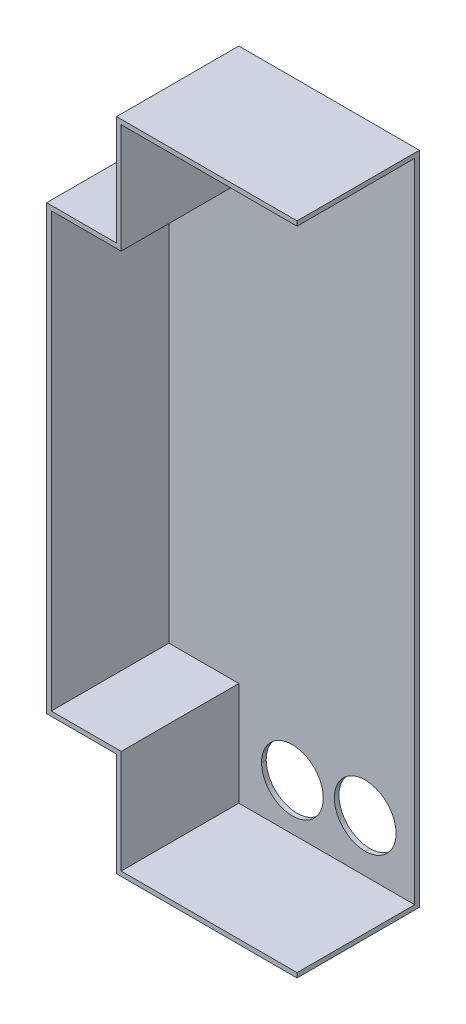
ISO-10303-21;
HEADER;
FILE_DESCRIPTION(('STEP AP214'),'2;1');
FILE_NAME('part.step','',(''),(''),'','','');
FILE_SCHEMA(('AUTOMOTIVE_DESIGN { 1 0 10303 214 1 1 1 1 }'));
ENDSEC;
DATA;
#1=APPLICATION_CONTEXT('core data for automotive mechanical design processes');
#2=APPLICATION_PROTOCOL_DEFINITION('international standard','automotive_design',2000,#1);
#3=PRODUCT_CONTEXT('',#1,'mechanical');
#4=PRODUCT('Part','Part','',(#3));
#5=PRODUCT_RELATED_PRODUCT_CATEGORY('part','',(#4));
#6=PRODUCT_DEFINITION_FORMATION('','',#4);
#7=PRODUCT_DEFINITION_CONTEXT('part definition',#1,'design');
#8=PRODUCT_DEFINITION('design','',#6,#7);
#9=PRODUCT_DEFINITION_SHAPE('','',#8);
#10=(LENGTH_UNIT() NAMED_UNIT(*) SI_UNIT(.MILLI.,.METRE.));
#11=(NAMED_UNIT(*) PLANE_ANGLE_UNIT() SI_UNIT($,.RADIAN.));
#12=(NAMED_UNIT(*) SI_UNIT($,.STERADIAN.) SOLID_ANGLE_UNIT());
#13=UNCERTAINTY_MEASURE_WITH_UNIT(LENGTH_MEASURE(1.E-05),#10,'distance_accuracy_value','');
#14=(GEOMETRIC_REPRESENTATION_CONTEXT(3) GLOBAL_UNCERTAINTY_ASSIGNED_CONTEXT((#13)) GLOBAL_UNIT_ASSIGNED_CONTEXT((#10,
#11,#12)) REPRESENTATION_CONTEXT('',''));
#15=CARTESIAN_POINT('',(0.,0.,0.));
#16=DIRECTION('',(0.,0.,1.));
#17=DIRECTION('',(1.,0.,0.));
#18=AXIS2_PLACEMENT_3D('',#15,#16,#17);
#19=CARTESIAN_POINT('',(-173.189136,68.461618,0.));
#20=DIRECTION('',(0.,0.,1.));
#21=DIRECTION('',(-1.,0.,0.));
#22=AXIS2_PLACEMENT_3D('',#19,#20,#21);
#23=CYLINDRICAL_SURFACE('',#22,2.65);
#24=CARTESIAN_POINT('',(-173.189136,68.461618,0.4));
#25=DIRECTION('',(0.,0.,1.));
#26=DIRECTION('',(1.,0.,0.));
#27=AXIS2_PLACEMENT_3D('',#24,#25,#26);
#28=CIRCLE('',#27,2.65);
#29=CARTESIAN_POINT('',(-175.839136,68.461618,0.4));
#30=VERTEX_POINT('',#29);
#31=CARTESIAN_POINT('',(-170.539136,68.461618,0.4));
#32=VERTEX_POINT('',#31);
#33=EDGE_CURVE('E311',#30,#32,#28,.T.);
#34=ORIENTED_EDGE('',*,*,#33,.T.);
#35=DIRECTION('',(0.,0.,1.));
#36=VECTOR('',#35,1.);
#37=CARTESIAN_POINT('',(-170.539136,68.461618,0.));
#38=LINE('',#37,#36);
#39=CARTESIAN_POINT('',(-170.539136,68.461618,0.));
#40=VERTEX_POINT('',#39);
#41=EDGE_CURVE('E39',#40,#32,#38,.T.);
#42=ORIENTED_EDGE('',*,*,#41,.F.);
#43=CARTESIAN_POINT('',(-173.189136,68.461618,0.));
#44=DIRECTION('',(0.,0.,-1.));
#45=DIRECTION('',(-1.,0.,0.));
#46=AXIS2_PLACEMENT_3D('',#43,#44,#45);
#47=CIRCLE('',#46,2.65);
#48=CARTESIAN_POINT('',(-175.839136,68.461618,0.));
#49=VERTEX_POINT('',#48);
#50=EDGE_CURVE('E331',#40,#49,#47,.T.);
#51=ORIENTED_EDGE('',*,*,#50,.T.);
#52=DIRECTION('',(0.,0.,1.));
#53=VECTOR('',#52,1.);
#54=CARTESIAN_POINT('',(-175.839136,68.461618,0.));
#55=LINE('',#54,#53);
#56=EDGE_CURVE('E26',#49,#30,#55,.T.);
#57=ORIENTED_EDGE('',*,*,#56,.T.);
#58=EDGE_LOOP('',(#34,#42,#51,#57));
#59=FACE_BOUND('',#58,.T.);
#60=ADVANCED_FACE('F17',(#59),#23,.F.);
#61=CARTESIAN_POINT('',(-166.9391344268,21.46163400861,-1.0836));
#62=DIRECTION('',(0.,0.,1.));
#63=DIRECTION('',(0.,1.,0.));
#64=AXIS2_PLACEMENT_3D('',#61,#62,#63);
#65=CYLINDRICAL_SURFACE('',#64,2.65);
#66=DIRECTION('',(0.,0.,1.));
#67=VECTOR('',#66,1.);
#68=CARTESIAN_POINT('',(-166.9391344268,24.11163400861,-1.0836));
#69=LINE('',#68,#67);
#70=CARTESIAN_POINT('',(-166.9391344268,24.11163400861,0.));
#71=VERTEX_POINT('',#70);
#72=CARTESIAN_POINT('',(-166.9391344268,24.11163400861,0.4));
#73=VERTEX_POINT('',#72);
#74=EDGE_CURVE('E456',#71,#73,#69,.T.);
#75=ORIENTED_EDGE('',*,*,#74,.T.);
#76=CARTESIAN_POINT('',(-166.9391344268,21.46163400861,0.4));
#77=DIRECTION('',(0.,0.,1.));
#78=DIRECTION('',(0.,-1.,0.));
#79=AXIS2_PLACEMENT_3D('',#76,#77,#78);
#80=CIRCLE('',#79,2.65);
#81=CARTESIAN_POINT('',(-166.9391344268,18.81163400861,0.4));
#82=VERTEX_POINT('',#81);
#83=EDGE_CURVE('E431',#73,#82,#80,.T.);
#84=ORIENTED_EDGE('',*,*,#83,.T.);
#85=DIRECTION('',(0.,0.,1.));
#86=VECTOR('',#85,1.);
#87=CARTESIAN_POINT('',(-166.9391344268,18.81163400861,-1.0836));
#88=LINE('',#87,#86);
#89=CARTESIAN_POINT('',(-166.9391344268,18.81163400861,0.));
#90=VERTEX_POINT('',#89);
#91=EDGE_CURVE('E453',#90,#82,#88,.T.);
#92=ORIENTED_EDGE('',*,*,#91,.F.);
#93=CARTESIAN_POINT('',(-166.9391344268,21.46163400861,0.));
#94=DIRECTION('',(0.,0.,-1.));
#95=DIRECTION('',(0.,1.,0.));
#96=AXIS2_PLACEMENT_3D('',#93,#94,#95);
#97=CIRCLE('',#96,2.65);
#98=EDGE_CURVE('E272',#90,#71,#97,.T.);
#99=ORIENTED_EDGE('',*,*,#98,.T.);
#100=EDGE_LOOP('',(#75,#84,#92,#99));
#101=FACE_BOUND('',#100,.T.);
#102=ADVANCED_FACE('F494',(#101),#65,.F.);
#103=CARTESIAN_POINT('',(-173.189136,20.961634,0.));
#104=DIRECTION('',(0.,0.,1.));
#105=DIRECTION('',(-1.,0.,0.));
#106=AXIS2_PLACEMENT_3D('',#103,#104,#105);
#107=CYLINDRICAL_SURFACE('',#106,2.65);
#108=DIRECTION('',(0.,0.,1.));
#109=VECTOR('',#108,1.);
#110=CARTESIAN_POINT('',(-175.839136,20.961634,0.));
#111=LINE('',#110,#109);
#112=CARTESIAN_POINT('',(-175.839136,20.961634,0.));
#113=VERTEX_POINT('',#112);
#114=CARTESIAN_POINT('',(-175.839136,20.961634,0.4));
#115=VERTEX_POINT('',#114);
#116=EDGE_CURVE('E20',#113,#115,#111,.T.);
#117=ORIENTED_EDGE('',*,*,#116,.T.);
#118=CARTESIAN_POINT('',(-173.189136,20.961634,0.4));
#119=DIRECTION('',(0.,0.,1.));
#120=DIRECTION('',(1.,0.,0.));
#121=AXIS2_PLACEMENT_3D('',#118,#119,#120);
#122=CIRCLE('',#121,2.65);
#123=CARTESIAN_POINT('',(-170.539136,20.961634,0.4));
#124=VERTEX_POINT('',#123);
#125=EDGE_CURVE('E345',#115,#124,#122,.T.);
#126=ORIENTED_EDGE('',*,*,#125,.T.);
#127=DIRECTION('',(0.,0.,1.));
#128=VECTOR('',#127,1.);
#129=CARTESIAN_POINT('',(-170.539136,20.961634,0.));
#130=LINE('',#129,#128);
#131=CARTESIAN_POINT('',(-170.539136,20.961634,0.));
#132=VERTEX_POINT('',#131);
#133=EDGE_CURVE('E423',#132,#124,#130,.T.);
#134=ORIENTED_EDGE('',*,*,#133,.F.);
#135=CARTESIAN_POINT('',(-173.189136,20.961634,0.));
#136=DIRECTION('',(0.,0.,-1.));
#137=DIRECTION('',(-1.,0.,0.));
#138=AXIS2_PLACEMENT_3D('',#135,#136,#137);
#139=CIRCLE('',#138,2.65);
#140=EDGE_CURVE('E324',#132,#113,#139,.T.);
#141=ORIENTED_EDGE('',*,*,#140,.T.);
#142=EDGE_LOOP('',(#117,#126,#134,#141));
#143=FACE_BOUND('',#142,.T.);
#144=ADVANCED_FACE('F469',(#143),#107,.F.);
#145=CARTESIAN_POINT('',(-184.189136,22.411626,0.));
#146=DIRECTION('',(-1.,0.,0.));
#147=DIRECTION('',(0.,0.,1.));
#148=AXIS2_PLACEMENT_3D('',#145,#146,#147);
#149=PLANE('',#148);
#150=DIRECTION('',(0.,1.,0.));
#151=VECTOR('',#150,1.);
#152=CARTESIAN_POINT('',(-184.189136,25.461626,0.));
#153=LINE('',#152,#151);
#154=CARTESIAN_POINT('',(-184.189136,25.461626,0.));
#155=VERTEX_POINT('',#154);
#156=CARTESIAN_POINT('',(-184.189136,63.461626,0.));
#157=VERTEX_POINT('',#156);
#158=EDGE_CURVE('E256',#155,#157,#153,.T.);
#159=ORIENTED_EDGE('',*,*,#158,.F.);
#160=DIRECTION('',(0.,0.,1.));
#161=VECTOR('',#160,1.);
#162=CARTESIAN_POINT('',(-184.189136,25.461626,0.));
#163=LINE('',#162,#161);
#164=CARTESIAN_POINT('',(-184.189136,25.461626,10.5));
#165=VERTEX_POINT('',#164);
#166=EDGE_CURVE('E11',#155,#165,#163,.T.);
#167=ORIENTED_EDGE('',*,*,#166,.T.);
#168=DIRECTION('',(0.,1.,0.));
#169=VECTOR('',#168,1.);
#170=CARTESIAN_POINT('',(-184.189136,25.461626,10.5));
#171=LINE('',#170,#169);
#172=CARTESIAN_POINT('',(-184.189136,63.461626,10.5));
#173=VERTEX_POINT('',#172);
#174=EDGE_CURVE('E359',#165,#173,#171,.T.);
#175=ORIENTED_EDGE('',*,*,#174,.T.);
#176=DIRECTION('',(0.,0.,1.));
#177=VECTOR('',#176,1.);
#178=CARTESIAN_POINT('',(-184.189136,63.461626,0.));
#179=LINE('',#178,#177);
#180=EDGE_CURVE('E424',#157,#173,#179,.T.);
#181=ORIENTED_EDGE('',*,*,#180,.F.);
#182=EDGE_LOOP('',(#159,#167,#175,#181));
#183=FACE_BOUND('',#182,.T.);
#184=ADVANCED_FACE('F558',(#183),#149,.T.);
#185=CARTESIAN_POINT('',(-172.989136,25.461626,0.));
#186=DIRECTION('',(0.,-1.,0.));
#187=DIRECTION('',(0.,0.,-1.));
#188=AXIS2_PLACEMENT_3D('',#185,#186,#187);
#189=PLANE('',#188);
#190=DIRECTION('',(-1.,0.,0.));
#191=VECTOR('',#190,1.);
#192=CARTESIAN_POINT('',(-178.189136,25.461626,0.));
#193=LINE('',#192,#191);
#194=CARTESIAN_POINT('',(-178.189136,25.461626,0.));
#195=VERTEX_POINT('',#194);
#196=EDGE_CURVE('E253',#195,#155,#193,.T.);
#197=ORIENTED_EDGE('',*,*,#196,.F.);
#198=DIRECTION('',(0.,0.,1.));
#199=VECTOR('',#198,1.);
#200=CARTESIAN_POINT('',(-178.189136,25.461626,0.));
#201=LINE('',#200,#199);
#202=CARTESIAN_POINT('',(-178.189136,25.461626,10.5));
#203=VERTEX_POINT('',#202);
#204=EDGE_CURVE('E225',#195,#203,#201,.T.);
#205=ORIENTED_EDGE('',*,*,#204,.T.);
#206=DIRECTION('',(-1.,0.,0.));
#207=VECTOR('',#206,1.);
#208=CARTESIAN_POINT('',(-178.189136,25.461626,10.5));
#209=LINE('',#208,#207);
#210=EDGE_CURVE('E284',#203,#165,#209,.T.);
#211=ORIENTED_EDGE('',*,*,#210,.T.);
#212=ORIENTED_EDGE('',*,*,#166,.F.);
#213=EDGE_LOOP('',(#197,#205,#211,#212));
#214=FACE_BOUND('',#213,.T.);
#215=ADVANCED_FACE('F554',(#214),#189,.T.);
#216=CARTESIAN_POINT('',(-178.189136,61.511626,0.));
#217=DIRECTION('',(-1.,0.,0.));
#218=DIRECTION('',(0.,0.,1.));
#219=AXIS2_PLACEMENT_3D('',#216,#217,#218);
#220=PLANE('',#219);
#221=DIRECTION('',(0.,1.,0.));
#222=VECTOR('',#221,1.);
#223=CARTESIAN_POINT('',(-178.189136,63.461626,0.));
#224=LINE('',#223,#222);
#225=CARTESIAN_POINT('',(-178.189136,63.461626,0.));
#226=VERTEX_POINT('',#225);
#227=CARTESIAN_POINT('',(-178.189136,72.861621,0.));
#228=VERTEX_POINT('',#227);
#229=EDGE_CURVE('E294',#226,#228,#224,.T.);
#230=ORIENTED_EDGE('',*,*,#229,.F.);
#231=DIRECTION('',(0.,0.,1.));
#232=VECTOR('',#231,1.);
#233=CARTESIAN_POINT('',(-178.189136,63.461626,0.));
#234=LINE('',#233,#232);
#235=CARTESIAN_POINT('',(-178.189136,63.461626,10.5));
#236=VERTEX_POINT('',#235);
#237=EDGE_CURVE('E420',#226,#236,#234,.T.);
#238=ORIENTED_EDGE('',*,*,#237,.T.);
#239=DIRECTION('',(0.,1.,0.));
#240=VECTOR('',#239,1.);
#241=CARTESIAN_POINT('',(-178.189136,63.461626,10.5));
#242=LINE('',#241,#240);
#243=CARTESIAN_POINT('',(-178.189136,72.861621,10.5));
#244=VERTEX_POINT('',#243);
#245=EDGE_CURVE('E299',#236,#244,#242,.T.);
#246=ORIENTED_EDGE('',*,*,#245,.T.);
#247=DIRECTION('',(0.,0.,1.));
#248=VECTOR('',#247,1.);
#249=CARTESIAN_POINT('',(-178.189136,72.861621,0.));
#250=LINE('',#249,#248);
#251=EDGE_CURVE('E259',#228,#244,#250,.T.);
#252=ORIENTED_EDGE('',*,*,#251,.F.);
#253=EDGE_LOOP('',(#230,#238,#246,#252));
#254=FACE_BOUND('',#253,.T.);
#255=ADVANCED_FACE('F562',(#254),#220,.T.);
#256=CARTESIAN_POINT('',(-173.189136,68.461618,0.));
#257=DIRECTION('',(0.,0.,1.));
#258=DIRECTION('',(-1.,0.,0.));
#259=AXIS2_PLACEMENT_3D('',#256,#257,#258);
#260=CYLINDRICAL_SURFACE('',#259,2.65);
#261=CARTESIAN_POINT('',(-173.189136,68.461618,0.));
#262=DIRECTION('',(0.,0.,-1.));
#263=DIRECTION('',(-1.,0.,0.));
#264=AXIS2_PLACEMENT_3D('',#261,#262,#263);
#265=CIRCLE('',#264,2.65);
#266=EDGE_CURVE('E328',#49,#40,#265,.T.);
#267=ORIENTED_EDGE('',*,*,#266,.T.);
#268=ORIENTED_EDGE('',*,*,#41,.T.);
#269=CARTESIAN_POINT('',(-173.189136,68.461618,0.4));
#270=DIRECTION('',(0.,0.,1.));
#271=DIRECTION('',(1.,0.,0.));
#272=AXIS2_PLACEMENT_3D('',#269,#270,#271);
#273=CIRCLE('',#272,2.65);
#274=EDGE_CURVE('E307',#32,#30,#273,.T.);
#275=ORIENTED_EDGE('',*,*,#274,.T.);
#276=ORIENTED_EDGE('',*,*,#56,.F.);
#277=EDGE_LOOP('',(#267,#268,#275,#276));
#278=FACE_BOUND('',#277,.T.);
#279=ADVANCED_FACE('F490',(#278),#260,.F.);
#280=CARTESIAN_POINT('',(-83.489134,72.861621,0.));
#281=DIRECTION('',(0.,1.,0.));
#282=DIRECTION('',(1.,0.,0.));
#283=AXIS2_PLACEMENT_3D('',#280,#281,#282);
#284=PLANE('',#283);
#285=DIRECTION('',(1.,0.,0.));
#286=VECTOR('',#285,1.);
#287=CARTESIAN_POINT('',(-178.189136,72.861621,0.));
#288=LINE('',#287,#286);
#289=CARTESIAN_POINT('',(-162.689136,72.861621,0.));
#290=VERTEX_POINT('',#289);
#291=EDGE_CURVE('E298',#228,#290,#288,.T.);
#292=ORIENTED_EDGE('',*,*,#291,.F.);
#293=ORIENTED_EDGE('',*,*,#251,.T.);
#294=DIRECTION('',(-1.,0.,0.));
#295=VECTOR('',#294,1.);
#296=CARTESIAN_POINT('',(-162.689136,72.861621,10.5));
#297=LINE('',#296,#295);
#298=CARTESIAN_POINT('',(-162.689136,72.861621,10.5));
#299=VERTEX_POINT('',#298);
#300=EDGE_CURVE('E304',#299,#244,#297,.T.);
#301=ORIENTED_EDGE('',*,*,#300,.F.);
#302=DIRECTION('',(0.,0.,-1.));
#303=VECTOR('',#302,1.);
#304=CARTESIAN_POINT('',(-162.689136,72.861621,10.5));
#305=LINE('',#304,#303);
#306=EDGE_CURVE('E289',#299,#290,#305,.T.);
#307=ORIENTED_EDGE('',*,*,#306,.T.);
#308=EDGE_LOOP('',(#292,#293,#301,#307));
#309=FACE_BOUND('',#308,.T.);
#310=ADVANCED_FACE('F479',(#309),#284,.T.);
#311=CARTESIAN_POINT('',(-173.189136,20.961634,0.));
#312=DIRECTION('',(0.,0.,1.));
#313=DIRECTION('',(-1.,0.,0.));
#314=AXIS2_PLACEMENT_3D('',#311,#312,#313);
#315=CYLINDRICAL_SURFACE('',#314,2.65);
#316=CARTESIAN_POINT('',(-173.189136,20.961634,0.));
#317=DIRECTION('',(0.,0.,-1.));
#318=DIRECTION('',(-1.,0.,0.));
#319=AXIS2_PLACEMENT_3D('',#316,#317,#318);
#320=CIRCLE('',#319,2.65);
#321=EDGE_CURVE('E276',#113,#132,#320,.T.);
#322=ORIENTED_EDGE('',*,*,#321,.T.);
#323=ORIENTED_EDGE('',*,*,#133,.T.);
#324=CARTESIAN_POINT('',(-173.189136,20.961634,0.4));
#325=DIRECTION('',(0.,0.,1.));
#326=DIRECTION('',(1.,0.,0.));
#327=AXIS2_PLACEMENT_3D('',#324,#325,#326);
#328=CIRCLE('',#327,2.65);
#329=EDGE_CURVE('E435',#124,#115,#328,.T.);
#330=ORIENTED_EDGE('',*,*,#329,.T.);
#331=ORIENTED_EDGE('',*,*,#116,.F.);
#332=EDGE_LOOP('',(#322,#323,#330,#331));
#333=FACE_BOUND('',#332,.T.);
#334=ADVANCED_FACE('F476',(#333),#315,.F.);
#335=CARTESIAN_POINT('',(-180.989136,63.461626,0.));
#336=DIRECTION('',(0.,1.,0.));
#337=DIRECTION('',(1.,0.,0.));
#338=AXIS2_PLACEMENT_3D('',#335,#336,#337);
#339=PLANE('',#338);
#340=DIRECTION('',(1.,0.,0.));
#341=VECTOR('',#340,1.);
#342=CARTESIAN_POINT('',(-184.189136,63.461626,0.));
#343=LINE('',#342,#341);
#344=EDGE_CURVE('E269',#157,#226,#343,.T.);
#345=ORIENTED_EDGE('',*,*,#344,.F.);
#346=ORIENTED_EDGE('',*,*,#180,.T.);
#347=DIRECTION('',(1.,0.,0.));
#348=VECTOR('',#347,1.);
#349=CARTESIAN_POINT('',(-184.189136,63.461626,10.5));
#350=LINE('',#349,#348);
#351=EDGE_CURVE('E303',#173,#236,#350,.T.);
#352=ORIENTED_EDGE('',*,*,#351,.T.);
#353=ORIENTED_EDGE('',*,*,#237,.F.);
#354=EDGE_LOOP('',(#345,#346,#352,#353));
#355=FACE_BOUND('',#354,.T.);
#356=ADVANCED_FACE('F478',(#355),#339,.T.);
#357=CARTESIAN_POINT('',(-166.9391344268,21.46163400861,-1.0836));
#358=DIRECTION('',(0.,0.,1.));
#359=DIRECTION('',(0.,1.,0.));
#360=AXIS2_PLACEMENT_3D('',#357,#358,#359);
#361=CYLINDRICAL_SURFACE('',#360,2.65);
#362=CARTESIAN_POINT('',(-166.9391344268,21.46163400861,0.));
#363=DIRECTION('',(0.,0.,-1.));
#364=DIRECTION('',(0.,1.,0.));
#365=AXIS2_PLACEMENT_3D('',#362,#363,#364);
#366=CIRCLE('',#365,2.65);
#367=EDGE_CURVE('E277',#71,#90,#366,.T.);
#368=ORIENTED_EDGE('',*,*,#367,.T.);
#369=ORIENTED_EDGE('',*,*,#91,.T.);
#370=CARTESIAN_POINT('',(-166.9391344268,21.46163400861,0.4));
#371=DIRECTION('',(0.,0.,1.));
#372=DIRECTION('',(0.,-1.,0.));
#373=AXIS2_PLACEMENT_3D('',#370,#371,#372);
#374=CIRCLE('',#373,2.65);
#375=EDGE_CURVE('E427',#82,#73,#374,.T.);
#376=ORIENTED_EDGE('',*,*,#375,.T.);
#377=ORIENTED_EDGE('',*,*,#74,.F.);
#378=EDGE_LOOP('',(#368,#369,#376,#377));
#379=FACE_BOUND('',#378,.T.);
#380=ADVANCED_FACE('F487',(#379),#361,.F.);
#381=CARTESIAN_POINT('',(-172.489136,63.061626,0.));
#382=DIRECTION('',(0.,-1.,0.));
#383=DIRECTION('',(0.,0.,-1.));
#384=AXIS2_PLACEMENT_3D('',#381,#382,#383);
#385=PLANE('',#384);
#386=DIRECTION('',(-1.,0.,0.));
#387=VECTOR('',#386,1.);
#388=CARTESIAN_POINT('',(-177.789136,63.061626,0.4));
#389=LINE('',#388,#387);
#390=CARTESIAN_POINT('',(-177.789136,63.061626,0.4));
#391=VERTEX_POINT('',#390);
#392=CARTESIAN_POINT('',(-183.789136,63.061626,0.4));
#393=VERTEX_POINT('',#392);
#394=EDGE_CURVE('E312',#391,#393,#389,.T.);
#395=ORIENTED_EDGE('',*,*,#394,.F.);
#396=DIRECTION('',(0.,0.,1.));
#397=VECTOR('',#396,1.);
#398=CARTESIAN_POINT('',(-177.789136,63.061626,0.4));
#399=LINE('',#398,#397);
#400=CARTESIAN_POINT('',(-177.789136,63.061626,10.5));
#401=VERTEX_POINT('',#400);
#402=EDGE_CURVE('E317',#391,#401,#399,.T.);
#403=ORIENTED_EDGE('',*,*,#402,.T.);
#404=DIRECTION('',(-1.,0.,0.));
#405=VECTOR('',#404,1.);
#406=CARTESIAN_POINT('',(-177.789136,63.061626,10.5));
#407=LINE('',#406,#405);
#408=CARTESIAN_POINT('',(-183.789136,63.061626,10.5));
#409=VERTEX_POINT('',#408);
#410=EDGE_CURVE('E380',#401,#409,#407,.T.);
#411=ORIENTED_EDGE('',*,*,#410,.T.);
#412=DIRECTION('',(0.,0.,-1.));
#413=VECTOR('',#412,1.);
#414=CARTESIAN_POINT('',(-183.789136,63.061626,10.5));
#415=LINE('',#414,#413);
#416=EDGE_CURVE('E450',#409,#393,#415,.T.);
#417=ORIENTED_EDGE('',*,*,#416,.T.);
#418=EDGE_LOOP('',(#395,#403,#411,#417));
#419=FACE_BOUND('',#418,.T.);
#420=ADVANCED_FACE('F535',(#419),#385,.T.);
#421=CARTESIAN_POINT('',(-183.789136,73.911626,0.));
#422=DIRECTION('',(1.,0.,0.));
#423=DIRECTION('',(0.,1.,0.));
#424=AXIS2_PLACEMENT_3D('',#421,#422,#423);
#425=PLANE('',#424);
#426=DIRECTION('',(0.,-1.,0.));
#427=VECTOR('',#426,1.);
#428=CARTESIAN_POINT('',(-183.789136,63.061626,0.4));
#429=LINE('',#428,#427);
#430=CARTESIAN_POINT('',(-183.789136,25.861626,0.4));
#431=VERTEX_POINT('',#430);
#432=EDGE_CURVE('E316',#393,#431,#429,.T.);
#433=ORIENTED_EDGE('',*,*,#432,.F.);
#434=ORIENTED_EDGE('',*,*,#416,.F.);
#435=DIRECTION('',(0.,-1.,0.));
#436=VECTOR('',#435,1.);
#437=CARTESIAN_POINT('',(-183.789136,63.061626,10.5));
#438=LINE('',#437,#436);
#439=CARTESIAN_POINT('',(-183.789136,25.861626,10.5));
#440=VERTEX_POINT('',#439);
#441=EDGE_CURVE('E376',#409,#440,#438,.T.);
#442=ORIENTED_EDGE('',*,*,#441,.T.);
#443=DIRECTION('',(0.,0.,-1.));
#444=VECTOR('',#443,1.);
#445=CARTESIAN_POINT('',(-183.789136,25.861626,10.5));
#446=LINE('',#445,#444);
#447=EDGE_CURVE('E447',#440,#431,#446,.T.);
#448=ORIENTED_EDGE('',*,*,#447,.T.);
#449=EDGE_LOOP('',(#433,#434,#442,#448));
#450=FACE_BOUND('',#449,.T.);
#451=ADVANCED_FACE('F538',(#450),#425,.T.);
#452=CARTESIAN_POINT('',(-180.489136,25.861626,0.));
#453=DIRECTION('',(0.,1.,0.));
#454=DIRECTION('',(1.,0.,0.));
#455=AXIS2_PLACEMENT_3D('',#452,#453,#454);
#456=PLANE('',#455);
#457=DIRECTION('',(1.,0.,0.));
#458=VECTOR('',#457,1.);
#459=CARTESIAN_POINT('',(-183.789136,25.861626,0.4));
#460=LINE('',#459,#458);
#461=CARTESIAN_POINT('',(-177.789136,25.861626,0.4));
#462=VERTEX_POINT('',#461);
#463=EDGE_CURVE('E411',#431,#462,#460,.T.);
#464=ORIENTED_EDGE('',*,*,#463,.F.);
#465=ORIENTED_EDGE('',*,*,#447,.F.);
#466=DIRECTION('',(1.,0.,0.));
#467=VECTOR('',#466,1.);
#468=CARTESIAN_POINT('',(-183.789136,25.861626,10.5));
#469=LINE('',#468,#467);
#470=CARTESIAN_POINT('',(-177.789136,25.861626,10.5));
#471=VERTEX_POINT('',#470);
#472=EDGE_CURVE('E372',#440,#471,#469,.T.);
#473=ORIENTED_EDGE('',*,*,#472,.T.);
#474=DIRECTION('',(0.,0.,1.));
#475=VECTOR('',#474,1.);
#476=CARTESIAN_POINT('',(-177.789136,25.861626,0.4));
#477=LINE('',#476,#475);
#478=EDGE_CURVE('E444',#462,#471,#477,.T.);
#479=ORIENTED_EDGE('',*,*,#478,.F.);
#480=EDGE_LOOP('',(#464,#465,#473,#479));
#481=FACE_BOUND('',#480,.T.);
#482=ADVANCED_FACE('F542',(#481),#456,.T.);
#483=CARTESIAN_POINT('',(-177.789136,29.661626,0.));
#484=DIRECTION('',(1.,0.,0.));
#485=DIRECTION('',(0.,1.,0.));
#486=AXIS2_PLACEMENT_3D('',#483,#484,#485);
#487=PLANE('',#486);
#488=DIRECTION('',(0.,-1.,0.));
#489=VECTOR('',#488,1.);
#490=CARTESIAN_POINT('',(-177.789136,25.861626,0.4));
#491=LINE('',#490,#489);
#492=CARTESIAN_POINT('',(-177.789136,16.961626,0.4));
#493=VERTEX_POINT('',#492);
#494=EDGE_CURVE('E415',#462,#493,#491,.T.);
#495=ORIENTED_EDGE('',*,*,#494,.F.);
#496=ORIENTED_EDGE('',*,*,#478,.T.);
#497=DIRECTION('',(0.,-1.,0.));
#498=VECTOR('',#497,1.);
#499=CARTESIAN_POINT('',(-177.789136,25.861626,10.5));
#500=LINE('',#499,#498);
#501=CARTESIAN_POINT('',(-177.789136,16.961626,10.5));
#502=VERTEX_POINT('',#501);
#503=EDGE_CURVE('E283',#471,#502,#500,.T.);
#504=ORIENTED_EDGE('',*,*,#503,.T.);
#505=DIRECTION('',(0.,0.,-1.));
#506=VECTOR('',#505,1.);
#507=CARTESIAN_POINT('',(-177.789136,16.961626,10.5));
#508=LINE('',#507,#506);
#509=EDGE_CURVE('E310',#502,#493,#508,.T.);
#510=ORIENTED_EDGE('',*,*,#509,.T.);
#511=EDGE_LOOP('',(#495,#496,#504,#510));
#512=FACE_BOUND('',#511,.T.);
#513=ADVANCED_FACE('F545',(#512),#487,.T.);
#514=CARTESIAN_POINT('',(-82.989134,16.961626,0.));
#515=DIRECTION('',(0.,1.,0.));
#516=DIRECTION('',(1.,0.,0.));
#517=AXIS2_PLACEMENT_3D('',#514,#515,#516);
#518=PLANE('',#517);
#519=DIRECTION('',(1.,0.,0.));
#520=VECTOR('',#519,1.);
#521=CARTESIAN_POINT('',(-177.789136,16.961626,0.4));
#522=LINE('',#521,#520);
#523=CARTESIAN_POINT('',(-162.689136,16.961626,0.4));
#524=VERTEX_POINT('',#523);
#525=EDGE_CURVE('E419',#493,#524,#522,.T.);
#526=ORIENTED_EDGE('',*,*,#525,.F.);
#527=ORIENTED_EDGE('',*,*,#509,.F.);
#528=DIRECTION('',(1.,0.,0.));
#529=VECTOR('',#528,1.);
#530=CARTESIAN_POINT('',(-177.789136,16.961626,10.5));
#531=LINE('',#530,#529);
#532=CARTESIAN_POINT('',(-162.689136,16.961626,10.5));
#533=VERTEX_POINT('',#532);
#534=EDGE_CURVE('E280',#502,#533,#531,.T.);
#535=ORIENTED_EDGE('',*,*,#534,.T.);
#536=DIRECTION('',(0.,0.,1.));
#537=VECTOR('',#536,1.);
#538=CARTESIAN_POINT('',(-162.689136,16.961626,0.4));
#539=LINE('',#538,#537);
#540=EDGE_CURVE('E290',#524,#533,#539,.T.);
#541=ORIENTED_EDGE('',*,*,#540,.F.);
#542=EDGE_LOOP('',(#526,#527,#535,#541));
#543=FACE_BOUND('',#542,.T.);
#544=ADVANCED_FACE('F518',(#543),#518,.T.);
#545=CARTESIAN_POINT('',(-54.37827,95.823247,0.4));
#546=DIRECTION('',(0.,0.,1.));
#547=DIRECTION('',(1.,0.,0.));
#548=AXIS2_PLACEMENT_3D('',#545,#546,#547);
#549=PLANE('',#548);
#550=ORIENTED_EDGE('',*,*,#33,.F.);
#551=ORIENTED_EDGE('',*,*,#274,.F.);
#552=EDGE_LOOP('',(#550,#551));
#553=FACE_BOUND('',#552,.T.);
#554=ORIENTED_EDGE('',*,*,#329,.F.);
#555=ORIENTED_EDGE('',*,*,#125,.F.);
#556=EDGE_LOOP('',(#554,#555));
#557=FACE_BOUND('',#556,.T.);
#558=ORIENTED_EDGE('',*,*,#375,.F.);
#559=ORIENTED_EDGE('',*,*,#83,.F.);
#560=EDGE_LOOP('',(#558,#559));
#561=FACE_BOUND('',#560,.T.);
#562=DIRECTION('',(0.,1.,0.));
#563=VECTOR('',#562,1.);
#564=CARTESIAN_POINT('',(-162.689136,16.961626,0.4));
#565=LINE('',#564,#563);
#566=CARTESIAN_POINT('',(-162.689136,72.461621,0.4));
#567=VERTEX_POINT('',#566);
#568=EDGE_CURVE('E335',#524,#567,#565,.T.);
#569=ORIENTED_EDGE('',*,*,#568,.T.);
#570=DIRECTION('',(-1.,0.,0.));
#571=VECTOR('',#570,1.);
#572=CARTESIAN_POINT('',(-162.689136,72.461621,0.4));
#573=LINE('',#572,#571);
#574=CARTESIAN_POINT('',(-177.789136,72.461621,0.4));
#575=VERTEX_POINT('',#574);
#576=EDGE_CURVE('E396',#567,#575,#573,.T.);
#577=ORIENTED_EDGE('',*,*,#576,.T.);
#578=DIRECTION('',(0.,-1.,0.));
#579=VECTOR('',#578,1.);
#580=CARTESIAN_POINT('',(-177.789136,72.461621,0.4));
#581=LINE('',#580,#579);
#582=EDGE_CURVE('E402',#575,#391,#581,.T.);
#583=ORIENTED_EDGE('',*,*,#582,.T.);
#584=ORIENTED_EDGE('',*,*,#394,.T.);
#585=ORIENTED_EDGE('',*,*,#432,.T.);
#586=ORIENTED_EDGE('',*,*,#463,.T.);
#587=ORIENTED_EDGE('',*,*,#494,.T.);
#588=ORIENTED_EDGE('',*,*,#525,.T.);
#589=EDGE_LOOP('',(#569,#577,#583,#584,#585,#586,#587,#588));
#590=FACE_BOUND('',#589,.T.);
#591=ADVANCED_FACE('F474',(#553,#557,#561,#590),#549,.T.);
#592=CARTESIAN_POINT('',(-177.789136,69.011626,0.));
#593=DIRECTION('',(1.,0.,0.));
#594=DIRECTION('',(0.,1.,0.));
#595=AXIS2_PLACEMENT_3D('',#592,#593,#594);
#596=PLANE('',#595);
#597=ORIENTED_EDGE('',*,*,#582,.F.);
#598=DIRECTION('',(0.,0.,-1.));
#599=VECTOR('',#598,1.);
#600=CARTESIAN_POINT('',(-177.789136,72.461621,10.5));
#601=LINE('',#600,#599);
#602=CARTESIAN_POINT('',(-177.789136,72.461621,10.5));
#603=VERTEX_POINT('',#602);
#604=EDGE_CURVE('E392',#603,#575,#601,.T.);
#605=ORIENTED_EDGE('',*,*,#604,.F.);
#606=DIRECTION('',(0.,-1.,0.));
#607=VECTOR('',#606,1.);
#608=CARTESIAN_POINT('',(-177.789136,72.461621,10.5));
#609=LINE('',#608,#607);
#610=EDGE_CURVE('E384',#603,#401,#609,.T.);
#611=ORIENTED_EDGE('',*,*,#610,.T.);
#612=ORIENTED_EDGE('',*,*,#402,.F.);
#613=EDGE_LOOP('',(#597,#605,#611,#612));
#614=FACE_BOUND('',#613,.T.);
#615=ADVANCED_FACE('F517',(#614),#596,.T.);
#616=CARTESIAN_POINT('',(-73.489134,72.461621,0.));
#617=DIRECTION('',(0.,-1.,0.));
#618=DIRECTION('',(0.,0.,-1.));
#619=AXIS2_PLACEMENT_3D('',#616,#617,#618);
#620=PLANE('',#619);
#621=ORIENTED_EDGE('',*,*,#604,.T.);
#622=ORIENTED_EDGE('',*,*,#576,.F.);
#623=DIRECTION('',(0.,0.,-1.));
#624=VECTOR('',#623,1.);
#625=CARTESIAN_POINT('',(-162.689136,72.461621,10.5));
#626=LINE('',#625,#624);
#627=CARTESIAN_POINT('',(-162.689136,72.461621,10.5));
#628=VERTEX_POINT('',#627);
#629=EDGE_CURVE('E342',#628,#567,#626,.T.);
#630=ORIENTED_EDGE('',*,*,#629,.F.);
#631=DIRECTION('',(-1.,0.,0.));
#632=VECTOR('',#631,1.);
#633=CARTESIAN_POINT('',(-162.689136,72.461621,10.5));
#634=LINE('',#633,#632);
#635=EDGE_CURVE('E388',#628,#603,#634,.T.);
#636=ORIENTED_EDGE('',*,*,#635,.T.);
#637=EDGE_LOOP('',(#621,#622,#630,#636));
#638=FACE_BOUND('',#637,.T.);
#639=ADVANCED_FACE('F528',(#638),#620,.T.);
#640=CARTESIAN_POINT('',(-54.37827,95.823247,10.5));
#641=DIRECTION('',(0.,0.,1.));
#642=DIRECTION('',(1.,0.,0.));
#643=AXIS2_PLACEMENT_3D('',#640,#641,#642);
#644=PLANE('',#643);
#645=DIRECTION('',(0.,1.,0.));
#646=VECTOR('',#645,1.);
#647=CARTESIAN_POINT('',(-162.689136,72.461621,10.5));
#648=LINE('',#647,#646);
#649=EDGE_CURVE('E338',#628,#299,#648,.T.);
#650=ORIENTED_EDGE('',*,*,#649,.T.);
#651=ORIENTED_EDGE('',*,*,#300,.T.);
#652=ORIENTED_EDGE('',*,*,#245,.F.);
#653=ORIENTED_EDGE('',*,*,#351,.F.);
#654=ORIENTED_EDGE('',*,*,#174,.F.);
#655=ORIENTED_EDGE('',*,*,#210,.F.);
#656=DIRECTION('',(0.,1.,0.));
#657=VECTOR('',#656,1.);
#658=CARTESIAN_POINT('',(-178.189136,16.561626,10.5));
#659=LINE('',#658,#657);
#660=CARTESIAN_POINT('',(-178.189136,16.561626,10.5));
#661=VERTEX_POINT('',#660);
#662=EDGE_CURVE('E229',#661,#203,#659,.T.);
#663=ORIENTED_EDGE('',*,*,#662,.F.);
#664=DIRECTION('',(1.,0.,0.));
#665=VECTOR('',#664,1.);
#666=CARTESIAN_POINT('',(-178.189136,16.561626,10.5));
#667=LINE('',#666,#665);
#668=CARTESIAN_POINT('',(-162.689136,16.561626,10.5));
#669=VERTEX_POINT('',#668);
#670=EDGE_CURVE('E230',#661,#669,#667,.T.);
#671=ORIENTED_EDGE('',*,*,#670,.T.);
#672=DIRECTION('',(0.,1.,0.));
#673=VECTOR('',#672,1.);
#674=CARTESIAN_POINT('',(-162.689136,16.561626,10.5));
#675=LINE('',#674,#673);
#676=EDGE_CURVE('E285',#669,#533,#675,.T.);
#677=ORIENTED_EDGE('',*,*,#676,.T.);
#678=ORIENTED_EDGE('',*,*,#534,.F.);
#679=ORIENTED_EDGE('',*,*,#503,.F.);
#680=ORIENTED_EDGE('',*,*,#472,.F.);
#681=ORIENTED_EDGE('',*,*,#441,.F.);
#682=ORIENTED_EDGE('',*,*,#410,.F.);
#683=ORIENTED_EDGE('',*,*,#610,.F.);
#684=ORIENTED_EDGE('',*,*,#635,.F.);
#685=EDGE_LOOP('',(#650,#651,#652,#653,#654,#655,#663,#671,#677,#678,#679,#680,#681,#682,#683,#684));
#686=FACE_BOUND('',#685,.T.);
#687=ADVANCED_FACE('F550',(#686),#644,.T.);
#688=CARTESIAN_POINT('',(-162.689136,8.7116235,-1.0836));
#689=DIRECTION('',(-1.,0.,0.));
#690=DIRECTION('',(0.,0.,1.));
#691=AXIS2_PLACEMENT_3D('',#688,#689,#690);
#692=PLANE('',#691);
#693=ORIENTED_EDGE('',*,*,#649,.F.);
#694=ORIENTED_EDGE('',*,*,#629,.T.);
#695=ORIENTED_EDGE('',*,*,#568,.F.);
#696=ORIENTED_EDGE('',*,*,#540,.T.);
#697=ORIENTED_EDGE('',*,*,#676,.F.);
#698=DIRECTION('',(0.,0.,1.));
#699=VECTOR('',#698,1.);
#700=CARTESIAN_POINT('',(-162.689136,16.561626,0.));
#701=LINE('',#700,#699);
#702=CARTESIAN_POINT('',(-162.689136,16.561626,0.));
#703=VERTEX_POINT('',#702);
#704=EDGE_CURVE('E242',#703,#669,#701,.T.);
#705=ORIENTED_EDGE('',*,*,#704,.F.);
#706=DIRECTION('',(0.,1.,0.));
#707=VECTOR('',#706,1.);
#708=CARTESIAN_POINT('',(-162.689136,16.561626,0.));
#709=LINE('',#708,#707);
#710=EDGE_CURVE('E237',#703,#290,#709,.T.);
#711=ORIENTED_EDGE('',*,*,#710,.T.);
#712=ORIENTED_EDGE('',*,*,#306,.F.);
#713=EDGE_LOOP('',(#693,#694,#695,#696,#697,#705,#711,#712));
#714=FACE_BOUND('',#713,.T.);
#715=ADVANCED_FACE('F507',(#714),#692,.F.);
#716=CARTESIAN_POINT('',(-52.37827,95.823247,0.));
#717=DIRECTION('',(0.,0.,1.));
#718=DIRECTION('',(1.,0.,0.));
#719=AXIS2_PLACEMENT_3D('',#716,#717,#718);
#720=PLANE('',#719);
#721=ORIENTED_EDGE('',*,*,#266,.F.);
#722=ORIENTED_EDGE('',*,*,#50,.F.);
#723=EDGE_LOOP('',(#721,#722));
#724=FACE_BOUND('',#723,.T.);
#725=ORIENTED_EDGE('',*,*,#321,.F.);
#726=ORIENTED_EDGE('',*,*,#140,.F.);
#727=EDGE_LOOP('',(#725,#726));
#728=FACE_BOUND('',#727,.T.);
#729=ORIENTED_EDGE('',*,*,#367,.F.);
#730=ORIENTED_EDGE('',*,*,#98,.F.);
#731=EDGE_LOOP('',(#729,#730));
#732=FACE_BOUND('',#731,.T.);
#733=ORIENTED_EDGE('',*,*,#710,.F.);
#734=DIRECTION('',(-1.,0.,0.));
#735=VECTOR('',#734,1.);
#736=CARTESIAN_POINT('',(-162.689136,16.561626,0.));
#737=LINE('',#736,#735);
#738=CARTESIAN_POINT('',(-178.189136,16.561626,0.));
#739=VERTEX_POINT('',#738);
#740=EDGE_CURVE('E233',#703,#739,#737,.T.);
#741=ORIENTED_EDGE('',*,*,#740,.T.);
#742=DIRECTION('',(0.,1.,0.));
#743=VECTOR('',#742,1.);
#744=CARTESIAN_POINT('',(-178.189136,16.561626,0.));
#745=LINE('',#744,#743);
#746=EDGE_CURVE('E218',#739,#195,#745,.T.);
#747=ORIENTED_EDGE('',*,*,#746,.T.);
#748=ORIENTED_EDGE('',*,*,#196,.T.);
#749=ORIENTED_EDGE('',*,*,#158,.T.);
#750=ORIENTED_EDGE('',*,*,#344,.T.);
#751=ORIENTED_EDGE('',*,*,#229,.T.);
#752=ORIENTED_EDGE('',*,*,#291,.T.);
#753=EDGE_LOOP('',(#733,#741,#747,#748,#749,#750,#751,#752));
#754=FACE_BOUND('',#753,.T.);
#755=ADVANCED_FACE('F234',(#724,#728,#732,#754),#720,.F.);
#756=CARTESIAN_POINT('',(-178.189136,21.161626,0.));
#757=DIRECTION('',(-1.,0.,0.));
#758=DIRECTION('',(0.,0.,1.));
#759=AXIS2_PLACEMENT_3D('',#756,#757,#758);
#760=PLANE('',#759);
#761=ORIENTED_EDGE('',*,*,#746,.F.);
#762=DIRECTION('',(0.,0.,1.));
#763=VECTOR('',#762,1.);
#764=CARTESIAN_POINT('',(-178.189136,16.561626,0.));
#765=LINE('',#764,#763);
#766=EDGE_CURVE('E223',#739,#661,#765,.T.);
#767=ORIENTED_EDGE('',*,*,#766,.T.);
#768=ORIENTED_EDGE('',*,*,#662,.T.);
#769=ORIENTED_EDGE('',*,*,#204,.F.);
#770=EDGE_LOOP('',(#761,#767,#768,#769));
#771=FACE_BOUND('',#770,.T.);
#772=ADVANCED_FACE('F220',(#771),#760,.T.);
#773=CARTESIAN_POINT('',(-73.489134,16.561626,0.));
#774=DIRECTION('',(0.,-1.,0.));
#775=DIRECTION('',(0.,0.,-1.));
#776=AXIS2_PLACEMENT_3D('',#773,#774,#775);
#777=PLANE('',#776);
#778=ORIENTED_EDGE('',*,*,#766,.F.);
#779=ORIENTED_EDGE('',*,*,#740,.F.);
#780=ORIENTED_EDGE('',*,*,#704,.T.);
#781=ORIENTED_EDGE('',*,*,#670,.F.);
#782=EDGE_LOOP('',(#778,#779,#780,#781));
#783=FACE_BOUND('',#782,.T.);
#784=ADVANCED_FACE('F245',(#783),#777,.T.);
#785=CLOSED_SHELL('',(#60,#102,#144,#184,#215,#255,#279,#310,#334,#356,#380,#420,#451,#482,#513,
#544,#591,#615,#639,#687,#715,#755,#772,#784));
#786=MANIFOLD_SOLID_BREP('B1',#785);
#787=ADVANCED_BREP_SHAPE_REPRESENTATION('',(#18,#786),#14);
#788=SHAPE_DEFINITION_REPRESENTATION(#9,#787);
ENDSEC;
END-ISO-10303-21;
